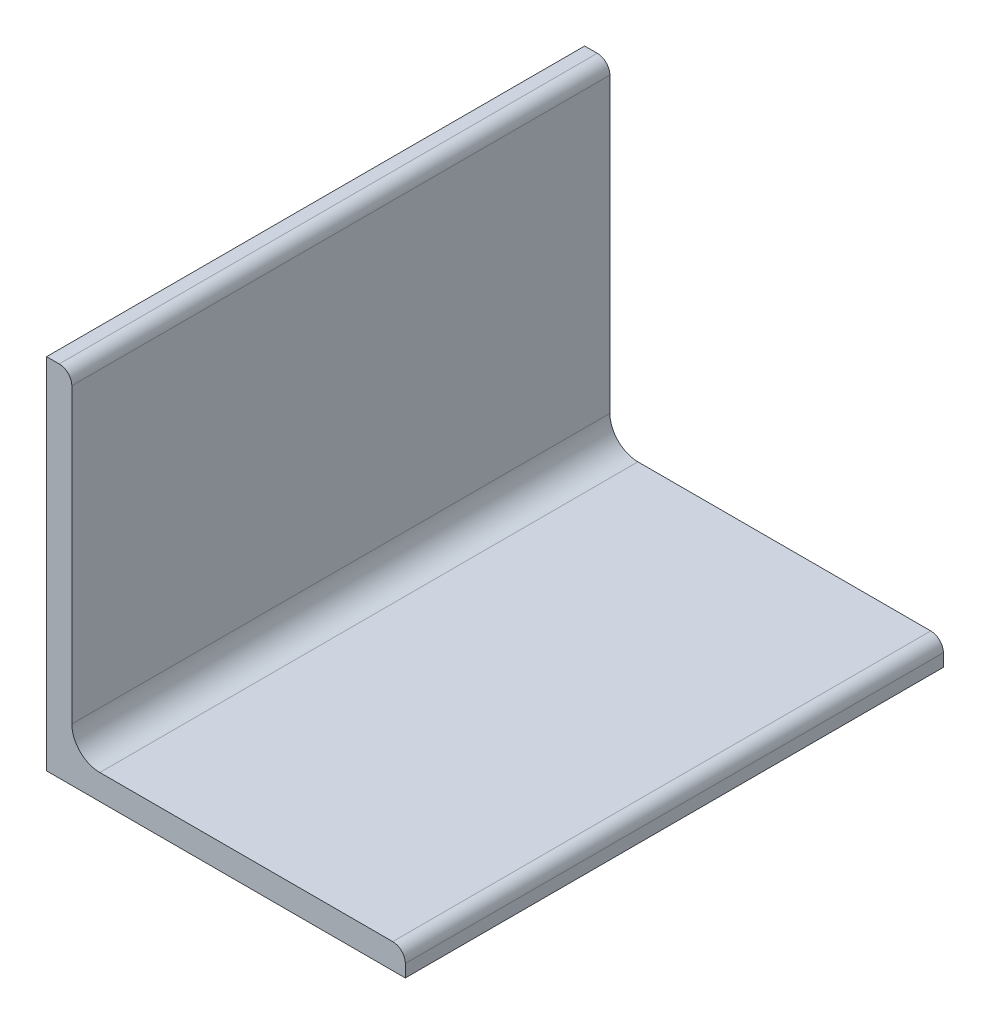
ISO-10303-21;
HEADER;
FILE_DESCRIPTION(('STEP AP214'),'2;1');
FILE_NAME('part.step','',(''),(''),'','','');
FILE_SCHEMA(('AUTOMOTIVE_DESIGN { 1 0 10303 214 1 1 1 1 }'));
ENDSEC;
DATA;
#1=APPLICATION_CONTEXT('core data for automotive mechanical design processes');
#2=APPLICATION_PROTOCOL_DEFINITION('international standard','automotive_design',2000,#1);
#3=PRODUCT_CONTEXT('',#1,'mechanical');
#4=PRODUCT('Part','Part','',(#3));
#5=PRODUCT_RELATED_PRODUCT_CATEGORY('part','',(#4));
#6=PRODUCT_DEFINITION_FORMATION('','',#4);
#7=PRODUCT_DEFINITION_CONTEXT('part definition',#1,'design');
#8=PRODUCT_DEFINITION('design','',#6,#7);
#9=PRODUCT_DEFINITION_SHAPE('','',#8);
#10=(LENGTH_UNIT() NAMED_UNIT(*) SI_UNIT(.MILLI.,.METRE.));
#11=(NAMED_UNIT(*) PLANE_ANGLE_UNIT() SI_UNIT($,.RADIAN.));
#12=(NAMED_UNIT(*) SI_UNIT($,.STERADIAN.) SOLID_ANGLE_UNIT());
#13=UNCERTAINTY_MEASURE_WITH_UNIT(LENGTH_MEASURE(1.E-05),#10,'distance_accuracy_value','');
#14=(GEOMETRIC_REPRESENTATION_CONTEXT(3) GLOBAL_UNCERTAINTY_ASSIGNED_CONTEXT((#13)) GLOBAL_UNIT_ASSIGNED_CONTEXT((#10,
#11,#12)) REPRESENTATION_CONTEXT('',''));
#15=CARTESIAN_POINT('',(0.,0.,0.));
#16=DIRECTION('',(0.,0.,1.));
#17=DIRECTION('',(1.,0.,0.));
#18=AXIS2_PLACEMENT_3D('',#15,#16,#17);
#19=CARTESIAN_POINT('',(1.17355224493876,203.678837479772,304.8));
#20=DIRECTION('',(1.,0.,0.));
#21=DIRECTION('',(0.,0.,-1.));
#22=AXIS2_PLACEMENT_3D('',#19,#20,#21);
#23=PLANE('',#22);
#24=DIRECTION('',(0.,-1.,0.));
#25=VECTOR('',#24,1.);
#26=CARTESIAN_POINT('',(1.17355224493876,203.678837479772,0.));
#27=LINE('',#26,#25);
#28=CARTESIAN_POINT('',(1.17355224493876,203.678837479772,0.));
#29=VERTEX_POINT('',#28);
#30=CARTESIAN_POINT('',(1.17355224493876,0.478837479771528,0.));
#31=VERTEX_POINT('',#30);
#32=EDGE_CURVE('E135',#29,#31,#27,.T.);
#33=ORIENTED_EDGE('',*,*,#32,.T.);
#34=DIRECTION('',(0.,0.,-1.));
#35=VECTOR('',#34,1.);
#36=CARTESIAN_POINT('',(1.17355224493876,0.478837479771528,304.8));
#37=LINE('',#36,#35);
#38=CARTESIAN_POINT('',(1.17355224493876,0.478837479771528,304.8));
#39=VERTEX_POINT('',#38);
#40=EDGE_CURVE('E11',#39,#31,#37,.T.);
#41=ORIENTED_EDGE('',*,*,#40,.F.);
#42=DIRECTION('',(0.,-1.,0.));
#43=VECTOR('',#42,1.);
#44=CARTESIAN_POINT('',(1.17355224493876,203.678837479772,304.8));
#45=LINE('',#44,#43);
#46=CARTESIAN_POINT('',(1.17355224493876,203.678837479772,304.8));
#47=VERTEX_POINT('',#46);
#48=EDGE_CURVE('E151',#47,#39,#45,.T.);
#49=ORIENTED_EDGE('',*,*,#48,.F.);
#50=DIRECTION('',(0.,0.,-1.));
#51=VECTOR('',#50,1.);
#52=CARTESIAN_POINT('',(1.17355224493876,203.678837479772,304.8));
#53=LINE('',#52,#51);
#54=EDGE_CURVE('E131',#47,#29,#53,.T.);
#55=ORIENTED_EDGE('',*,*,#54,.T.);
#56=EDGE_LOOP('',(#33,#41,#49,#55));
#57=FACE_BOUND('',#56,.T.);
#58=ADVANCED_FACE('F33',(#57),#23,.F.);
#59=CARTESIAN_POINT('',(1.17355224493876,0.478837479771528,304.8));
#60=DIRECTION('',(0.,1.,0.));
#61=DIRECTION('',(0.,0.,1.));
#62=AXIS2_PLACEMENT_3D('',#59,#60,#61);
#63=PLANE('',#62);
#64=DIRECTION('',(1.,0.,0.));
#65=VECTOR('',#64,1.);
#66=CARTESIAN_POINT('',(1.17355224493876,0.478837479771528,0.));
#67=LINE('',#66,#65);
#68=CARTESIAN_POINT('',(204.373552244939,0.478837479771528,0.));
#69=VERTEX_POINT('',#68);
#70=EDGE_CURVE('E138',#31,#69,#67,.T.);
#71=ORIENTED_EDGE('',*,*,#70,.T.);
#72=DIRECTION('',(0.,0.,-1.));
#73=VECTOR('',#72,1.);
#74=CARTESIAN_POINT('',(204.373552244939,0.478837479771528,304.8));
#75=LINE('',#74,#73);
#76=CARTESIAN_POINT('',(204.373552244939,0.478837479771528,304.8));
#77=VERTEX_POINT('',#76);
#78=EDGE_CURVE('E41',#77,#69,#75,.T.);
#79=ORIENTED_EDGE('',*,*,#78,.F.);
#80=DIRECTION('',(1.,0.,0.));
#81=VECTOR('',#80,1.);
#82=CARTESIAN_POINT('',(1.17355224493876,0.478837479771528,304.8));
#83=LINE('',#82,#81);
#84=EDGE_CURVE('E95',#39,#77,#83,.T.);
#85=ORIENTED_EDGE('',*,*,#84,.F.);
#86=ORIENTED_EDGE('',*,*,#40,.T.);
#87=EDGE_LOOP('',(#71,#79,#85,#86));
#88=FACE_BOUND('',#87,.T.);
#89=ADVANCED_FACE('F194',(#88),#63,.F.);
#90=CARTESIAN_POINT('',(204.373552244939,0.478837479771528,304.8));
#91=DIRECTION('',(-1.,0.,0.));
#92=DIRECTION('',(0.,0.,1.));
#93=AXIS2_PLACEMENT_3D('',#90,#91,#92);
#94=PLANE('',#93);
#95=DIRECTION('',(0.,1.,0.));
#96=VECTOR('',#95,1.);
#97=CARTESIAN_POINT('',(204.373552244939,0.478837479771528,0.));
#98=LINE('',#97,#96);
#99=CARTESIAN_POINT('',(204.373552244939,7.62258747977153,0.));
#100=VERTEX_POINT('',#99);
#101=EDGE_CURVE('E140',#69,#100,#98,.T.);
#102=ORIENTED_EDGE('',*,*,#101,.T.);
#103=DIRECTION('',(0.,0.,-1.));
#104=VECTOR('',#103,1.);
#105=CARTESIAN_POINT('',(204.373552244939,7.62258747977153,304.8));
#106=LINE('',#105,#104);
#107=CARTESIAN_POINT('',(204.373552244939,7.62258747977153,304.8));
#108=VERTEX_POINT('',#107);
#109=EDGE_CURVE('E161',#108,#100,#106,.T.);
#110=ORIENTED_EDGE('',*,*,#109,.F.);
#111=DIRECTION('',(0.,1.,0.));
#112=VECTOR('',#111,1.);
#113=CARTESIAN_POINT('',(204.373552244939,0.478837479771528,304.8));
#114=LINE('',#113,#112);
#115=EDGE_CURVE('E169',#77,#108,#114,.T.);
#116=ORIENTED_EDGE('',*,*,#115,.F.);
#117=ORIENTED_EDGE('',*,*,#78,.T.);
#118=EDGE_LOOP('',(#102,#110,#116,#117));
#119=FACE_BOUND('',#118,.T.);
#120=ADVANCED_FACE('F167',(#119),#94,.F.);
#121=CARTESIAN_POINT('',(197.229802244939,7.62258747977153,304.8));
#122=DIRECTION('',(0.,0.,-1.));
#123=DIRECTION('',(-1.,0.,0.));
#124=AXIS2_PLACEMENT_3D('',#121,#122,#123);
#125=CYLINDRICAL_SURFACE('',#124,7.14375);
#126=CARTESIAN_POINT('',(197.229802244939,7.62258747977153,0.));
#127=DIRECTION('',(0.,0.,1.));
#128=DIRECTION('',(1.,0.,0.));
#129=AXIS2_PLACEMENT_3D('',#126,#127,#128);
#130=CIRCLE('',#129,7.14375);
#131=CARTESIAN_POINT('',(197.229802244939,14.7663374797715,0.));
#132=VERTEX_POINT('',#131);
#133=EDGE_CURVE('E142',#100,#132,#130,.T.);
#134=ORIENTED_EDGE('',*,*,#133,.T.);
#135=DIRECTION('',(0.,0.,-1.));
#136=VECTOR('',#135,1.);
#137=CARTESIAN_POINT('',(197.229802244939,14.7663374797715,304.8));
#138=LINE('',#137,#136);
#139=CARTESIAN_POINT('',(197.229802244939,14.7663374797715,304.8));
#140=VERTEX_POINT('',#139);
#141=EDGE_CURVE('E158',#140,#132,#138,.T.);
#142=ORIENTED_EDGE('',*,*,#141,.F.);
#143=CARTESIAN_POINT('',(197.229802244939,7.62258747977153,304.8));
#144=DIRECTION('',(0.,0.,1.));
#145=DIRECTION('',(1.,0.,0.));
#146=AXIS2_PLACEMENT_3D('',#143,#144,#145);
#147=CIRCLE('',#146,7.14375);
#148=EDGE_CURVE('E185',#108,#140,#147,.T.);
#149=ORIENTED_EDGE('',*,*,#148,.F.);
#150=ORIENTED_EDGE('',*,*,#109,.T.);
#151=EDGE_LOOP('',(#134,#142,#149,#150));
#152=FACE_BOUND('',#151,.T.);
#153=ADVANCED_FACE('F178',(#152),#125,.T.);
#154=CARTESIAN_POINT('',(197.229802244939,14.7663374797715,304.8));
#155=DIRECTION('',(0.,-1.,0.));
#156=DIRECTION('',(1.,0.,0.));
#157=AXIS2_PLACEMENT_3D('',#154,#155,#156);
#158=PLANE('',#157);
#159=DIRECTION('',(-1.,0.,0.));
#160=VECTOR('',#159,1.);
#161=CARTESIAN_POINT('',(197.229802244939,14.7663374797715,0.));
#162=LINE('',#161,#160);
#163=CARTESIAN_POINT('',(31.3360522449388,14.7663374797716,0.));
#164=VERTEX_POINT('',#163);
#165=EDGE_CURVE('E144',#132,#164,#162,.T.);
#166=ORIENTED_EDGE('',*,*,#165,.T.);
#167=DIRECTION('',(0.,0.,-1.));
#168=VECTOR('',#167,1.);
#169=CARTESIAN_POINT('',(31.3360522449388,14.7663374797716,304.8));
#170=LINE('',#169,#168);
#171=CARTESIAN_POINT('',(31.3360522449388,14.7663374797716,304.8));
#172=VERTEX_POINT('',#171);
#173=EDGE_CURVE('E155',#172,#164,#170,.T.);
#174=ORIENTED_EDGE('',*,*,#173,.F.);
#175=DIRECTION('',(-1.,0.,0.));
#176=VECTOR('',#175,1.);
#177=CARTESIAN_POINT('',(197.229802244939,14.7663374797715,304.8));
#178=LINE('',#177,#176);
#179=EDGE_CURVE('E184',#140,#172,#178,.T.);
#180=ORIENTED_EDGE('',*,*,#179,.F.);
#181=ORIENTED_EDGE('',*,*,#141,.T.);
#182=EDGE_LOOP('',(#166,#174,#180,#181));
#183=FACE_BOUND('',#182,.T.);
#184=ADVANCED_FACE('F182',(#183),#158,.F.);
#185=CARTESIAN_POINT('',(31.3360522449387,30.6413374797715,304.8));
#186=DIRECTION('',(0.,0.,-1.));
#187=DIRECTION('',(-1.,0.,0.));
#188=AXIS2_PLACEMENT_3D('',#185,#186,#187);
#189=CYLINDRICAL_SURFACE('',#188,15.875);
#190=CARTESIAN_POINT('',(31.3360522449387,30.6413374797715,0.));
#191=DIRECTION('',(0.,0.,-1.));
#192=DIRECTION('',(1.,0.,0.));
#193=AXIS2_PLACEMENT_3D('',#190,#191,#192);
#194=CIRCLE('',#193,15.875);
#195=CARTESIAN_POINT('',(15.4610522449388,30.6413374797716,0.));
#196=VERTEX_POINT('',#195);
#197=EDGE_CURVE('E146',#164,#196,#194,.T.);
#198=ORIENTED_EDGE('',*,*,#197,.T.);
#199=DIRECTION('',(0.,0.,-1.));
#200=VECTOR('',#199,1.);
#201=CARTESIAN_POINT('',(15.4610522449388,30.6413374797716,304.8));
#202=LINE('',#201,#200);
#203=CARTESIAN_POINT('',(15.4610522449388,30.6413374797716,304.8));
#204=VERTEX_POINT('',#203);
#205=EDGE_CURVE('E126',#204,#196,#202,.T.);
#206=ORIENTED_EDGE('',*,*,#205,.F.);
#207=CARTESIAN_POINT('',(31.3360522449387,30.6413374797715,304.8));
#208=DIRECTION('',(0.,0.,-1.));
#209=DIRECTION('',(1.,0.,0.));
#210=AXIS2_PLACEMENT_3D('',#207,#208,#209);
#211=CIRCLE('',#210,15.875);
#212=EDGE_CURVE('E117',#172,#204,#211,.T.);
#213=ORIENTED_EDGE('',*,*,#212,.F.);
#214=ORIENTED_EDGE('',*,*,#173,.T.);
#215=EDGE_LOOP('',(#198,#206,#213,#214));
#216=FACE_BOUND('',#215,.T.);
#217=ADVANCED_FACE('F206',(#216),#189,.F.);
#218=CARTESIAN_POINT('',(15.4610522449388,30.6413374797716,304.8));
#219=DIRECTION('',(-1.,0.,0.));
#220=DIRECTION('',(0.,0.,1.));
#221=AXIS2_PLACEMENT_3D('',#218,#219,#220);
#222=PLANE('',#221);
#223=DIRECTION('',(0.,1.,0.));
#224=VECTOR('',#223,1.);
#225=CARTESIAN_POINT('',(15.4610522449388,30.6413374797716,0.));
#226=LINE('',#225,#224);
#227=CARTESIAN_POINT('',(15.4610522449388,196.535087479772,0.));
#228=VERTEX_POINT('',#227);
#229=EDGE_CURVE('E125',#196,#228,#226,.T.);
#230=ORIENTED_EDGE('',*,*,#229,.T.);
#231=DIRECTION('',(0.,0.,-1.));
#232=VECTOR('',#231,1.);
#233=CARTESIAN_POINT('',(15.4610522449388,196.535087479772,304.8));
#234=LINE('',#233,#232);
#235=CARTESIAN_POINT('',(15.4610522449388,196.535087479772,304.8));
#236=VERTEX_POINT('',#235);
#237=EDGE_CURVE('E122',#236,#228,#234,.T.);
#238=ORIENTED_EDGE('',*,*,#237,.F.);
#239=DIRECTION('',(0.,1.,0.));
#240=VECTOR('',#239,1.);
#241=CARTESIAN_POINT('',(15.4610522449388,30.6413374797716,304.8));
#242=LINE('',#241,#240);
#243=EDGE_CURVE('E111',#204,#236,#242,.T.);
#244=ORIENTED_EDGE('',*,*,#243,.F.);
#245=ORIENTED_EDGE('',*,*,#205,.T.);
#246=EDGE_LOOP('',(#230,#238,#244,#245));
#247=FACE_BOUND('',#246,.T.);
#248=ADVANCED_FACE('F123',(#247),#222,.F.);
#249=CARTESIAN_POINT('',(8.31730224493875,196.535087479772,304.8));
#250=DIRECTION('',(0.,0.,-1.));
#251=DIRECTION('',(-1.,0.,0.));
#252=AXIS2_PLACEMENT_3D('',#249,#250,#251);
#253=CYLINDRICAL_SURFACE('',#252,7.14375000000001);
#254=CARTESIAN_POINT('',(8.31730224493875,196.535087479772,0.));
#255=DIRECTION('',(0.,0.,1.));
#256=DIRECTION('',(1.,0.,0.));
#257=AXIS2_PLACEMENT_3D('',#254,#255,#256);
#258=CIRCLE('',#257,7.14375000000001);
#259=CARTESIAN_POINT('',(8.31730224493876,203.678837479772,0.));
#260=VERTEX_POINT('',#259);
#261=EDGE_CURVE('E81',#228,#260,#258,.T.);
#262=ORIENTED_EDGE('',*,*,#261,.T.);
#263=DIRECTION('',(0.,0.,-1.));
#264=VECTOR('',#263,1.);
#265=CARTESIAN_POINT('',(8.31730224493876,203.678837479772,304.8));
#266=LINE('',#265,#264);
#267=CARTESIAN_POINT('',(8.31730224493876,203.678837479772,304.8));
#268=VERTEX_POINT('',#267);
#269=EDGE_CURVE('E127',#268,#260,#266,.T.);
#270=ORIENTED_EDGE('',*,*,#269,.F.);
#271=CARTESIAN_POINT('',(8.31730224493875,196.535087479772,304.8));
#272=DIRECTION('',(0.,0.,1.));
#273=DIRECTION('',(1.,0.,0.));
#274=AXIS2_PLACEMENT_3D('',#271,#272,#273);
#275=CIRCLE('',#274,7.14375000000001);
#276=EDGE_CURVE('E115',#236,#268,#275,.T.);
#277=ORIENTED_EDGE('',*,*,#276,.F.);
#278=ORIENTED_EDGE('',*,*,#237,.T.);
#279=EDGE_LOOP('',(#262,#270,#277,#278));
#280=FACE_BOUND('',#279,.T.);
#281=ADVANCED_FACE('F129',(#280),#253,.T.);
#282=CARTESIAN_POINT('',(8.31730224493876,203.678837479772,304.8));
#283=DIRECTION('',(0.,-1.,0.));
#284=DIRECTION('',(0.,0.,-1.));
#285=AXIS2_PLACEMENT_3D('',#282,#283,#284);
#286=PLANE('',#285);
#287=DIRECTION('',(-1.,0.,0.));
#288=VECTOR('',#287,1.);
#289=CARTESIAN_POINT('',(8.31730224493876,203.678837479772,0.));
#290=LINE('',#289,#288);
#291=EDGE_CURVE('E87',#260,#29,#290,.T.);
#292=ORIENTED_EDGE('',*,*,#291,.T.);
#293=ORIENTED_EDGE('',*,*,#54,.F.);
#294=DIRECTION('',(-1.,0.,0.));
#295=VECTOR('',#294,1.);
#296=CARTESIAN_POINT('',(8.31730224493876,203.678837479772,304.8));
#297=LINE('',#296,#295);
#298=EDGE_CURVE('E49',#268,#47,#297,.T.);
#299=ORIENTED_EDGE('',*,*,#298,.F.);
#300=ORIENTED_EDGE('',*,*,#269,.T.);
#301=EDGE_LOOP('',(#292,#293,#299,#300));
#302=FACE_BOUND('',#301,.T.);
#303=ADVANCED_FACE('F214',(#302),#286,.F.);
#304=CARTESIAN_POINT('',(197.229802244939,7.62258747977153,304.8));
#305=DIRECTION('',(0.,0.,1.));
#306=DIRECTION('',(1.,0.,0.));
#307=AXIS2_PLACEMENT_3D('',#304,#305,#306);
#308=PLANE('',#307);
#309=ORIENTED_EDGE('',*,*,#48,.T.);
#310=ORIENTED_EDGE('',*,*,#84,.T.);
#311=ORIENTED_EDGE('',*,*,#115,.T.);
#312=ORIENTED_EDGE('',*,*,#148,.T.);
#313=ORIENTED_EDGE('',*,*,#179,.T.);
#314=ORIENTED_EDGE('',*,*,#212,.T.);
#315=ORIENTED_EDGE('',*,*,#243,.T.);
#316=ORIENTED_EDGE('',*,*,#276,.T.);
#317=ORIENTED_EDGE('',*,*,#298,.T.);
#318=EDGE_LOOP('',(#309,#310,#311,#312,#313,#314,#315,#316,#317));
#319=FACE_BOUND('',#318,.T.);
#320=ADVANCED_FACE('F113',(#319),#308,.T.);
#321=CARTESIAN_POINT('',(197.229802244939,7.62258747977153,0.));
#322=DIRECTION('',(0.,0.,1.));
#323=DIRECTION('',(1.,0.,0.));
#324=AXIS2_PLACEMENT_3D('',#321,#322,#323);
#325=PLANE('',#324);
#326=ORIENTED_EDGE('',*,*,#32,.F.);
#327=ORIENTED_EDGE('',*,*,#291,.F.);
#328=ORIENTED_EDGE('',*,*,#261,.F.);
#329=ORIENTED_EDGE('',*,*,#229,.F.);
#330=ORIENTED_EDGE('',*,*,#197,.F.);
#331=ORIENTED_EDGE('',*,*,#165,.F.);
#332=ORIENTED_EDGE('',*,*,#133,.F.);
#333=ORIENTED_EDGE('',*,*,#101,.F.);
#334=ORIENTED_EDGE('',*,*,#70,.F.);
#335=EDGE_LOOP('',(#326,#327,#328,#329,#330,#331,#332,#333,#334));
#336=FACE_BOUND('',#335,.T.);
#337=ADVANCED_FACE('F173',(#336),#325,.F.);
#338=CLOSED_SHELL('',(#58,#89,#120,#153,#184,#217,#248,#281,#303,#320,#337));
#339=MANIFOLD_SOLID_BREP('B2',#338);
#340=ADVANCED_BREP_SHAPE_REPRESENTATION('',(#18,#339),#14);
#341=SHAPE_DEFINITION_REPRESENTATION(#9,#340);
ENDSEC;
END-ISO-10303-21;
